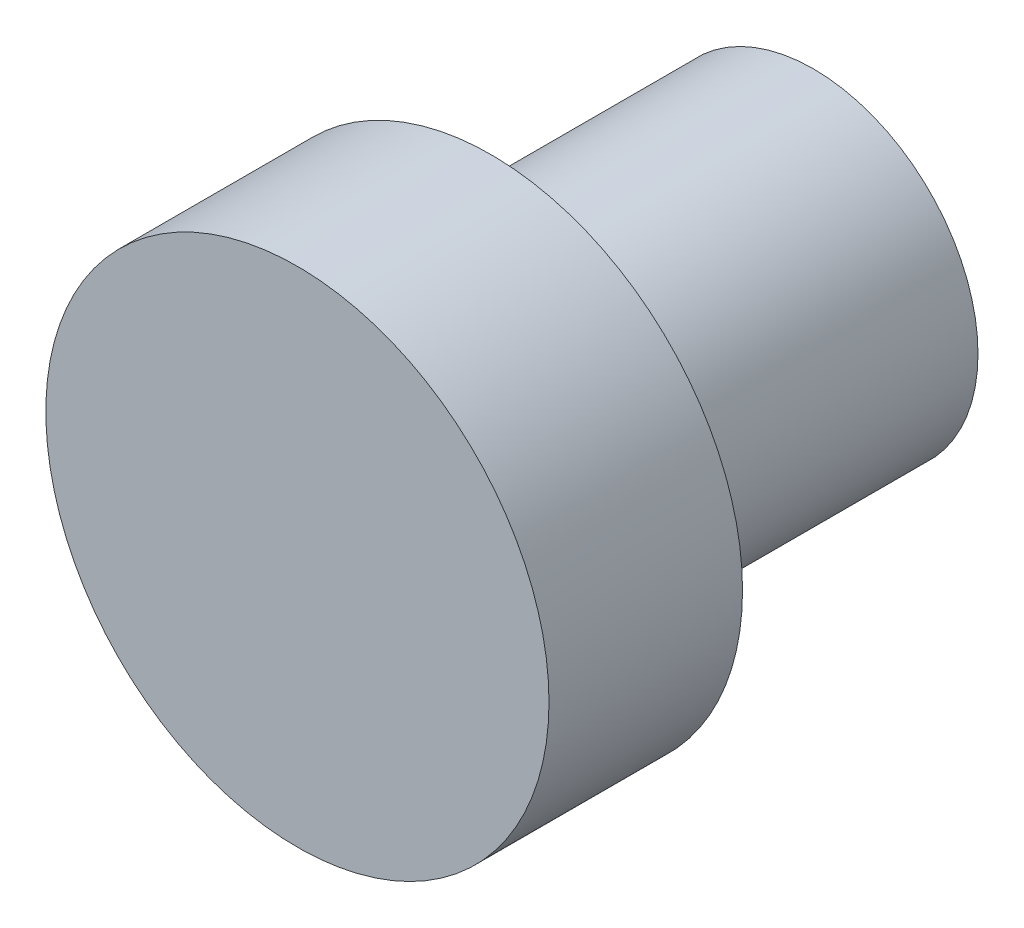
ISO-10303-21;
HEADER;
FILE_DESCRIPTION(('STEP AP214'),'2;1');
FILE_NAME('part.step','',(''),(''),'','','');
FILE_SCHEMA(('AUTOMOTIVE_DESIGN { 1 0 10303 214 1 1 1 1 }'));
ENDSEC;
DATA;
#1=APPLICATION_CONTEXT('core data for automotive mechanical design processes');
#2=APPLICATION_PROTOCOL_DEFINITION('international standard','automotive_design',2000,#1);
#3=PRODUCT_CONTEXT('',#1,'mechanical');
#4=PRODUCT('Part','Part','',(#3));
#5=PRODUCT_RELATED_PRODUCT_CATEGORY('part','',(#4));
#6=PRODUCT_DEFINITION_FORMATION('','',#4);
#7=PRODUCT_DEFINITION_CONTEXT('part definition',#1,'design');
#8=PRODUCT_DEFINITION('design','',#6,#7);
#9=PRODUCT_DEFINITION_SHAPE('','',#8);
#10=(LENGTH_UNIT() NAMED_UNIT(*) SI_UNIT(.MILLI.,.METRE.));
#11=(NAMED_UNIT(*) PLANE_ANGLE_UNIT() SI_UNIT($,.RADIAN.));
#12=(NAMED_UNIT(*) SI_UNIT($,.STERADIAN.) SOLID_ANGLE_UNIT());
#13=UNCERTAINTY_MEASURE_WITH_UNIT(LENGTH_MEASURE(1.E-05),#10,'distance_accuracy_value','');
#14=(GEOMETRIC_REPRESENTATION_CONTEXT(3) GLOBAL_UNCERTAINTY_ASSIGNED_CONTEXT((#13)) GLOBAL_UNIT_ASSIGNED_CONTEXT((#10,
#11,#12)) REPRESENTATION_CONTEXT('',''));
#15=CARTESIAN_POINT('',(0.,0.,0.));
#16=DIRECTION('',(0.,0.,1.));
#17=DIRECTION('',(1.,0.,0.));
#18=AXIS2_PLACEMENT_3D('',#15,#16,#17);
#19=CARTESIAN_POINT('',(0.,0.,8.));
#20=DIRECTION('',(0.,0.,-1.));
#21=DIRECTION('',(-1.,0.,0.));
#22=AXIS2_PLACEMENT_3D('',#19,#20,#21);
#23=CYLINDRICAL_SURFACE('',#22,2.55);
#24=CARTESIAN_POINT('',(0.,0.,0.));
#25=DIRECTION('',(0.,0.,1.));
#26=DIRECTION('',(1.,0.,0.));
#27=AXIS2_PLACEMENT_3D('',#24,#25,#26);
#28=CIRCLE('',#27,2.55);
#29=CARTESIAN_POINT('',(2.55,0.,0.));
#30=VERTEX_POINT('',#29);
#31=EDGE_CURVE('E47',#30,#30,#28,.T.);
#32=ORIENTED_EDGE('',*,*,#31,.T.);
#33=EDGE_LOOP('',(#32));
#34=FACE_BOUND('',#33,.T.);
#35=CARTESIAN_POINT('',(0.,0.,5.));
#36=DIRECTION('',(0.,0.,1.));
#37=DIRECTION('',(1.,0.,0.));
#38=AXIS2_PLACEMENT_3D('',#35,#36,#37);
#39=CIRCLE('',#38,2.55);
#40=CARTESIAN_POINT('',(2.55,0.,5.));
#41=VERTEX_POINT('',#40);
#42=EDGE_CURVE('E10',#41,#41,#39,.T.);
#43=ORIENTED_EDGE('',*,*,#42,.F.);
#44=EDGE_LOOP('',(#43));
#45=FACE_BOUND('',#44,.T.);
#46=ADVANCED_FACE('F40',(#34,#45),#23,.T.);
#47=CARTESIAN_POINT('',(0.,0.,0.));
#48=DIRECTION('',(0.,0.,1.));
#49=DIRECTION('',(1.,0.,0.));
#50=AXIS2_PLACEMENT_3D('',#47,#48,#49);
#51=PLANE('',#50);
#52=ORIENTED_EDGE('',*,*,#31,.F.);
#53=EDGE_LOOP('',(#52));
#54=FACE_BOUND('',#53,.T.);
#55=ADVANCED_FACE('F69',(#54),#51,.F.);
#56=CARTESIAN_POINT('',(0.,0.,5.));
#57=DIRECTION('',(0.,0.,1.));
#58=DIRECTION('',(1.,0.,0.));
#59=AXIS2_PLACEMENT_3D('',#56,#57,#58);
#60=CYLINDRICAL_SURFACE('',#59,3.9);
#61=CARTESIAN_POINT('',(0.,0.,5.));
#62=DIRECTION('',(0.,0.,1.));
#63=DIRECTION('',(1.,0.,0.));
#64=AXIS2_PLACEMENT_3D('',#61,#62,#63);
#65=CIRCLE('',#64,3.9);
#66=CARTESIAN_POINT('',(3.9,0.,5.));
#67=VERTEX_POINT('',#66);
#68=EDGE_CURVE('E52',#67,#67,#65,.T.);
#69=ORIENTED_EDGE('',*,*,#68,.T.);
#70=EDGE_LOOP('',(#69));
#71=FACE_BOUND('',#70,.T.);
#72=CARTESIAN_POINT('',(0.,0.,8.));
#73=DIRECTION('',(0.,0.,1.));
#74=DIRECTION('',(1.,0.,0.));
#75=AXIS2_PLACEMENT_3D('',#72,#73,#74);
#76=CIRCLE('',#75,3.9);
#77=CARTESIAN_POINT('',(3.9,0.,8.));
#78=VERTEX_POINT('',#77);
#79=EDGE_CURVE('E57',#78,#78,#76,.T.);
#80=ORIENTED_EDGE('',*,*,#79,.F.);
#81=EDGE_LOOP('',(#80));
#82=FACE_BOUND('',#81,.T.);
#83=ADVANCED_FACE('F66',(#71,#82),#60,.T.);
#84=CARTESIAN_POINT('',(0.,0.,5.));
#85=DIRECTION('',(0.,0.,1.));
#86=DIRECTION('',(1.,0.,0.));
#87=AXIS2_PLACEMENT_3D('',#84,#85,#86);
#88=PLANE('',#87);
#89=ORIENTED_EDGE('',*,*,#42,.T.);
#90=EDGE_LOOP('',(#89));
#91=FACE_BOUND('',#90,.T.);
#92=ORIENTED_EDGE('',*,*,#68,.F.);
#93=EDGE_LOOP('',(#92));
#94=FACE_BOUND('',#93,.T.);
#95=ADVANCED_FACE('F68',(#91,#94),#88,.F.);
#96=CARTESIAN_POINT('',(0.,0.,8.));
#97=DIRECTION('',(0.,0.,1.));
#98=DIRECTION('',(1.,0.,0.));
#99=AXIS2_PLACEMENT_3D('',#96,#97,#98);
#100=PLANE('',#99);
#101=ORIENTED_EDGE('',*,*,#79,.T.);
#102=EDGE_LOOP('',(#101));
#103=FACE_BOUND('',#102,.T.);
#104=ADVANCED_FACE('F64',(#103),#100,.T.);
#105=CLOSED_SHELL('',(#46,#55,#83,#95,#104));
#106=MANIFOLD_SOLID_BREP('B2',#105);
#107=ADVANCED_BREP_SHAPE_REPRESENTATION('',(#18,#106),#14);
#108=SHAPE_DEFINITION_REPRESENTATION(#9,#107);
ENDSEC;
END-ISO-10303-21;
